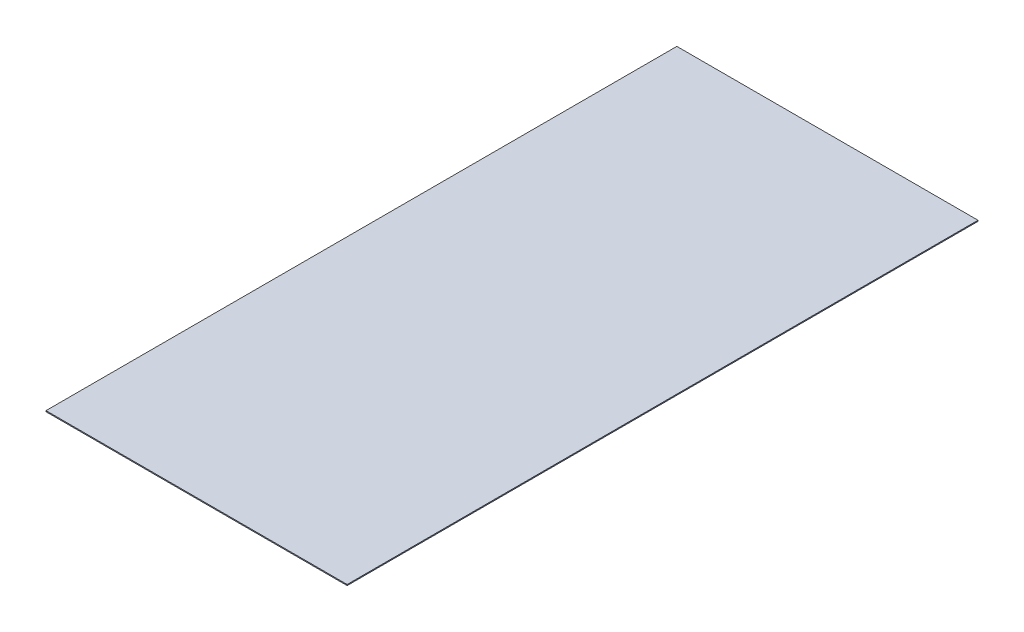
ISO-10303-21;
HEADER;
FILE_DESCRIPTION(('STEP AP214'),'2;1');
FILE_NAME('part.step','',(''),(''),'','','');
FILE_SCHEMA(('AUTOMOTIVE_DESIGN { 1 0 10303 214 1 1 1 1 }'));
ENDSEC;
DATA;
#1=APPLICATION_CONTEXT('core data for automotive mechanical design processes');
#2=APPLICATION_PROTOCOL_DEFINITION('international standard','automotive_design',2000,#1);
#3=PRODUCT_CONTEXT('',#1,'mechanical');
#4=PRODUCT('Part','Part','',(#3));
#5=PRODUCT_RELATED_PRODUCT_CATEGORY('part','',(#4));
#6=PRODUCT_DEFINITION_FORMATION('','',#4);
#7=PRODUCT_DEFINITION_CONTEXT('part definition',#1,'design');
#8=PRODUCT_DEFINITION('design','',#6,#7);
#9=PRODUCT_DEFINITION_SHAPE('','',#8);
#10=(LENGTH_UNIT() NAMED_UNIT(*) SI_UNIT(.MILLI.,.METRE.));
#11=(NAMED_UNIT(*) PLANE_ANGLE_UNIT() SI_UNIT($,.RADIAN.));
#12=(NAMED_UNIT(*) SI_UNIT($,.STERADIAN.) SOLID_ANGLE_UNIT());
#13=UNCERTAINTY_MEASURE_WITH_UNIT(LENGTH_MEASURE(1.E-05),#10,'distance_accuracy_value','');
#14=(GEOMETRIC_REPRESENTATION_CONTEXT(3) GLOBAL_UNCERTAINTY_ASSIGNED_CONTEXT((#13)) GLOBAL_UNIT_ASSIGNED_CONTEXT((#10,
#11,#12)) REPRESENTATION_CONTEXT('',''));
#15=CARTESIAN_POINT('',(0.,0.,0.));
#16=DIRECTION('',(0.,0.,1.));
#17=DIRECTION('',(1.,0.,0.));
#18=AXIS2_PLACEMENT_3D('',#15,#16,#17);
#19=CARTESIAN_POINT('',(-30.05,0.,62.95));
#20=DIRECTION('',(0.,1.,0.));
#21=DIRECTION('',(0.,0.,1.));
#22=AXIS2_PLACEMENT_3D('',#19,#20,#21);
#23=PLANE('',#22);
#24=DIRECTION('',(0.,0.,-1.));
#25=VECTOR('',#24,1.);
#26=CARTESIAN_POINT('',(30.05,0.,-62.95));
#27=LINE('',#26,#25);
#28=CARTESIAN_POINT('',(30.05,0.,-62.95));
#29=VERTEX_POINT('',#28);
#30=CARTESIAN_POINT('',(30.05,0.,62.95));
#31=VERTEX_POINT('',#30);
#32=EDGE_CURVE('E58',#29,#31,#27,.F.);
#33=ORIENTED_EDGE('',*,*,#32,.F.);
#34=DIRECTION('',(-1.,0.,0.));
#35=VECTOR('',#34,1.);
#36=CARTESIAN_POINT('',(-30.05,0.,-62.95));
#37=LINE('',#36,#35);
#38=CARTESIAN_POINT('',(-30.05,0.,-62.95));
#39=VERTEX_POINT('',#38);
#40=EDGE_CURVE('E53',#39,#29,#37,.F.);
#41=ORIENTED_EDGE('',*,*,#40,.F.);
#42=DIRECTION('',(0.,0.,1.));
#43=VECTOR('',#42,1.);
#44=CARTESIAN_POINT('',(-30.05,0.,-62.95));
#45=LINE('',#44,#43);
#46=CARTESIAN_POINT('',(-30.05,0.,62.95));
#47=VERTEX_POINT('',#46);
#48=EDGE_CURVE('E68',#47,#39,#45,.F.);
#49=ORIENTED_EDGE('',*,*,#48,.F.);
#50=DIRECTION('',(1.,0.,0.));
#51=VECTOR('',#50,1.);
#52=CARTESIAN_POINT('',(-30.05,0.,62.95));
#53=LINE('',#52,#51);
#54=EDGE_CURVE('E20',#31,#47,#53,.F.);
#55=ORIENTED_EDGE('',*,*,#54,.F.);
#56=EDGE_LOOP('',(#33,#41,#49,#55));
#57=FACE_BOUND('',#56,.T.);
#58=ADVANCED_FACE('F17',(#57),#23,.T.);
#59=CARTESIAN_POINT('',(-30.05,-0.2,62.95));
#60=DIRECTION('',(0.,0.,1.));
#61=DIRECTION('',(1.,0.,0.));
#62=AXIS2_PLACEMENT_3D('',#59,#60,#61);
#63=PLANE('',#62);
#64=DIRECTION('',(1.,0.,0.));
#65=VECTOR('',#64,1.);
#66=CARTESIAN_POINT('',(-30.05,-0.2,62.95));
#67=LINE('',#66,#65);
#68=CARTESIAN_POINT('',(-30.05,-0.2,62.95));
#69=VERTEX_POINT('',#68);
#70=CARTESIAN_POINT('',(30.05,-0.2,62.95));
#71=VERTEX_POINT('',#70);
#72=EDGE_CURVE('E74',#69,#71,#67,.T.);
#73=ORIENTED_EDGE('',*,*,#72,.T.);
#74=DIRECTION('',(0.,1.,0.));
#75=VECTOR('',#74,1.);
#76=CARTESIAN_POINT('',(30.05,-0.2,62.95));
#77=LINE('',#76,#75);
#78=EDGE_CURVE('E63',#31,#71,#77,.F.);
#79=ORIENTED_EDGE('',*,*,#78,.F.);
#80=ORIENTED_EDGE('',*,*,#54,.T.);
#81=DIRECTION('',(0.,1.,0.));
#82=VECTOR('',#81,1.);
#83=CARTESIAN_POINT('',(-30.05,-0.2,62.95));
#84=LINE('',#83,#82);
#85=EDGE_CURVE('E81',#69,#47,#84,.T.);
#86=ORIENTED_EDGE('',*,*,#85,.F.);
#87=EDGE_LOOP('',(#73,#79,#80,#86));
#88=FACE_BOUND('',#87,.T.);
#89=ADVANCED_FACE('F73',(#88),#63,.T.);
#90=CARTESIAN_POINT('',(30.05,-0.2,-62.95));
#91=DIRECTION('',(1.,0.,0.));
#92=DIRECTION('',(0.,0.,-1.));
#93=AXIS2_PLACEMENT_3D('',#90,#91,#92);
#94=PLANE('',#93);
#95=DIRECTION('',(0.,0.,1.));
#96=VECTOR('',#95,1.);
#97=CARTESIAN_POINT('',(30.05,-0.2,62.95));
#98=LINE('',#97,#96);
#99=CARTESIAN_POINT('',(30.05,-0.2,-62.95));
#100=VERTEX_POINT('',#99);
#101=EDGE_CURVE('E84',#71,#100,#98,.F.);
#102=ORIENTED_EDGE('',*,*,#101,.T.);
#103=DIRECTION('',(0.,1.,0.));
#104=VECTOR('',#103,1.);
#105=CARTESIAN_POINT('',(30.05,-0.2,-62.95));
#106=LINE('',#105,#104);
#107=EDGE_CURVE('E65',#29,#100,#106,.F.);
#108=ORIENTED_EDGE('',*,*,#107,.F.);
#109=ORIENTED_EDGE('',*,*,#32,.T.);
#110=ORIENTED_EDGE('',*,*,#78,.T.);
#111=EDGE_LOOP('',(#102,#108,#109,#110));
#112=FACE_BOUND('',#111,.T.);
#113=ADVANCED_FACE('F61',(#112),#94,.T.);
#114=CARTESIAN_POINT('',(-30.05,-0.2,-62.95));
#115=DIRECTION('',(0.,0.,-1.));
#116=DIRECTION('',(-1.,0.,0.));
#117=AXIS2_PLACEMENT_3D('',#114,#115,#116);
#118=PLANE('',#117);
#119=DIRECTION('',(1.,0.,0.));
#120=VECTOR('',#119,1.);
#121=CARTESIAN_POINT('',(-30.05,-0.2,-62.95));
#122=LINE('',#121,#120);
#123=CARTESIAN_POINT('',(-30.05,-0.2,-62.95));
#124=VERTEX_POINT('',#123);
#125=EDGE_CURVE('E26',#100,#124,#122,.F.);
#126=ORIENTED_EDGE('',*,*,#125,.T.);
#127=DIRECTION('',(0.,1.,0.));
#128=VECTOR('',#127,1.);
#129=CARTESIAN_POINT('',(-30.05,-0.2,-62.95));
#130=LINE('',#129,#128);
#131=EDGE_CURVE('E34',#39,#124,#130,.F.);
#132=ORIENTED_EDGE('',*,*,#131,.F.);
#133=ORIENTED_EDGE('',*,*,#40,.T.);
#134=ORIENTED_EDGE('',*,*,#107,.T.);
#135=EDGE_LOOP('',(#126,#132,#133,#134));
#136=FACE_BOUND('',#135,.T.);
#137=ADVANCED_FACE('F88',(#136),#118,.T.);
#138=CARTESIAN_POINT('',(-30.05,-0.2,-62.95));
#139=DIRECTION('',(-1.,0.,0.));
#140=DIRECTION('',(0.,0.,1.));
#141=AXIS2_PLACEMENT_3D('',#138,#139,#140);
#142=PLANE('',#141);
#143=DIRECTION('',(0.,0.,1.));
#144=VECTOR('',#143,1.);
#145=CARTESIAN_POINT('',(-30.05,-0.2,62.95));
#146=LINE('',#145,#144);
#147=EDGE_CURVE('E11',#124,#69,#146,.T.);
#148=ORIENTED_EDGE('',*,*,#147,.T.);
#149=ORIENTED_EDGE('',*,*,#85,.T.);
#150=ORIENTED_EDGE('',*,*,#48,.T.);
#151=ORIENTED_EDGE('',*,*,#131,.T.);
#152=EDGE_LOOP('',(#148,#149,#150,#151));
#153=FACE_BOUND('',#152,.T.);
#154=ADVANCED_FACE('F91',(#153),#142,.T.);
#155=CARTESIAN_POINT('',(-30.05,-0.2,62.95));
#156=DIRECTION('',(0.,1.,0.));
#157=DIRECTION('',(0.,0.,1.));
#158=AXIS2_PLACEMENT_3D('',#155,#156,#157);
#159=PLANE('',#158);
#160=ORIENTED_EDGE('',*,*,#125,.F.);
#161=ORIENTED_EDGE('',*,*,#101,.F.);
#162=ORIENTED_EDGE('',*,*,#72,.F.);
#163=ORIENTED_EDGE('',*,*,#147,.F.);
#164=EDGE_LOOP('',(#160,#161,#162,#163));
#165=FACE_BOUND('',#164,.T.);
#166=ADVANCED_FACE('F90',(#165),#159,.F.);
#167=CLOSED_SHELL('',(#58,#89,#113,#137,#154,#166));
#168=MANIFOLD_SOLID_BREP('B1',#167);
#169=ADVANCED_BREP_SHAPE_REPRESENTATION('',(#18,#168),#14);
#170=SHAPE_DEFINITION_REPRESENTATION(#9,#169);
ENDSEC;
END-ISO-10303-21;
